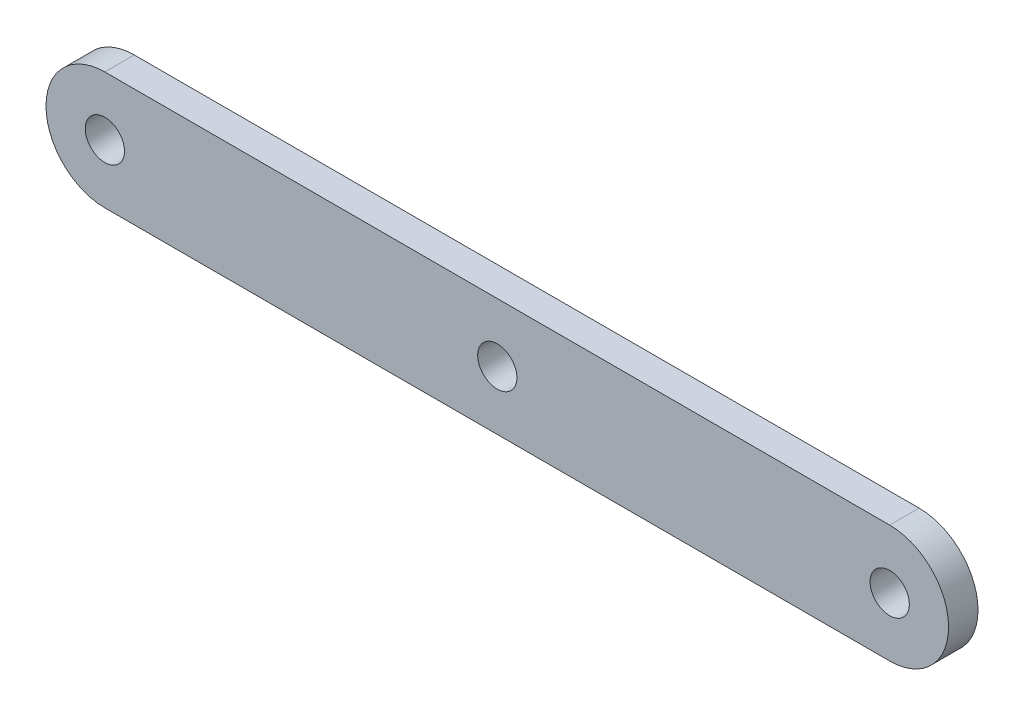
ISO-10303-21;
HEADER;
FILE_DESCRIPTION(('STEP AP214'),'2;1');
FILE_NAME('part.step','',(''),(''),'','','');
FILE_SCHEMA(('AUTOMOTIVE_DESIGN { 1 0 10303 214 1 1 1 1 }'));
ENDSEC;
DATA;
#1=APPLICATION_CONTEXT('core data for automotive mechanical design processes');
#2=APPLICATION_PROTOCOL_DEFINITION('international standard','automotive_design',2000,#1);
#3=PRODUCT_CONTEXT('',#1,'mechanical');
#4=PRODUCT('Part','Part','',(#3));
#5=PRODUCT_RELATED_PRODUCT_CATEGORY('part','',(#4));
#6=PRODUCT_DEFINITION_FORMATION('','',#4);
#7=PRODUCT_DEFINITION_CONTEXT('part definition',#1,'design');
#8=PRODUCT_DEFINITION('design','',#6,#7);
#9=PRODUCT_DEFINITION_SHAPE('','',#8);
#10=(LENGTH_UNIT() NAMED_UNIT(*) SI_UNIT(.MILLI.,.METRE.));
#11=(NAMED_UNIT(*) PLANE_ANGLE_UNIT() SI_UNIT($,.RADIAN.));
#12=(NAMED_UNIT(*) SI_UNIT($,.STERADIAN.) SOLID_ANGLE_UNIT());
#13=UNCERTAINTY_MEASURE_WITH_UNIT(LENGTH_MEASURE(1.E-05),#10,'distance_accuracy_value','');
#14=(GEOMETRIC_REPRESENTATION_CONTEXT(3) GLOBAL_UNCERTAINTY_ASSIGNED_CONTEXT((#13)) GLOBAL_UNIT_ASSIGNED_CONTEXT((#10,
#11,#12)) REPRESENTATION_CONTEXT('',''));
#15=CARTESIAN_POINT('',(0.,0.,0.));
#16=DIRECTION('',(0.,0.,1.));
#17=DIRECTION('',(1.,0.,0.));
#18=AXIS2_PLACEMENT_3D('',#15,#16,#17);
#19=CARTESIAN_POINT('',(-35.3127241673783,0.,3.));
#20=DIRECTION('',(0.,0.,1.));
#21=DIRECTION('',(1.,0.,0.));
#22=AXIS2_PLACEMENT_3D('',#19,#20,#21);
#23=PLANE('',#22);
#24=CARTESIAN_POINT('',(44.6872758326217,0.,3.));
#25=DIRECTION('',(0.,0.,1.));
#26=DIRECTION('',(1.,0.,0.));
#27=AXIS2_PLACEMENT_3D('',#24,#25,#26);
#28=CIRCLE('',#27,2.);
#29=CARTESIAN_POINT('',(46.6872758326217,0.,3.));
#30=VERTEX_POINT('',#29);
#31=EDGE_CURVE('E115',#30,#30,#28,.T.);
#32=ORIENTED_EDGE('',*,*,#31,.F.);
#33=EDGE_LOOP('',(#32));
#34=FACE_BOUND('',#33,.T.);
#35=CARTESIAN_POINT('',(-35.3127241673783,0.,3.));
#36=DIRECTION('',(0.,0.,1.));
#37=DIRECTION('',(1.,0.,0.));
#38=AXIS2_PLACEMENT_3D('',#35,#36,#37);
#39=CIRCLE('',#38,6.);
#40=CARTESIAN_POINT('',(-35.3127241673783,6.,3.));
#41=VERTEX_POINT('',#40);
#42=CARTESIAN_POINT('',(-35.3127241673783,-6.,3.));
#43=VERTEX_POINT('',#42);
#44=EDGE_CURVE('E85',#41,#43,#39,.T.);
#45=ORIENTED_EDGE('',*,*,#44,.T.);
#46=DIRECTION('',(1.,0.,0.));
#47=VECTOR('',#46,1.);
#48=CARTESIAN_POINT('',(-35.3127241673783,-6.,3.));
#49=LINE('',#48,#47);
#50=CARTESIAN_POINT('',(44.6872758326217,-6.,3.));
#51=VERTEX_POINT('',#50);
#52=EDGE_CURVE('E80',#43,#51,#49,.T.);
#53=ORIENTED_EDGE('',*,*,#52,.T.);
#54=CARTESIAN_POINT('',(44.6872758326217,0.,3.));
#55=DIRECTION('',(0.,0.,1.));
#56=DIRECTION('',(1.,0.,0.));
#57=AXIS2_PLACEMENT_3D('',#54,#55,#56);
#58=CIRCLE('',#57,6.);
#59=CARTESIAN_POINT('',(44.6872758326217,6.,3.));
#60=VERTEX_POINT('',#59);
#61=EDGE_CURVE('E83',#51,#60,#58,.T.);
#62=ORIENTED_EDGE('',*,*,#61,.T.);
#63=DIRECTION('',(-1.,0.,0.));
#64=VECTOR('',#63,1.);
#65=CARTESIAN_POINT('',(-35.3127241673783,6.,3.));
#66=LINE('',#65,#64);
#67=EDGE_CURVE('E50',#60,#41,#66,.T.);
#68=ORIENTED_EDGE('',*,*,#67,.T.);
#69=EDGE_LOOP('',(#45,#53,#62,#68));
#70=FACE_BOUND('',#69,.T.);
#71=CARTESIAN_POINT('',(-35.3127241673783,0.,3.));
#72=DIRECTION('',(0.,0.,1.));
#73=DIRECTION('',(1.,0.,0.));
#74=AXIS2_PLACEMENT_3D('',#71,#72,#73);
#75=CIRCLE('',#74,2.);
#76=CARTESIAN_POINT('',(-33.3127241673783,0.,3.));
#77=VERTEX_POINT('',#76);
#78=EDGE_CURVE('E100',#77,#77,#75,.T.);
#79=ORIENTED_EDGE('',*,*,#78,.F.);
#80=EDGE_LOOP('',(#79));
#81=FACE_BOUND('',#80,.T.);
#82=CARTESIAN_POINT('',(4.68727583262171,0.,3.));
#83=DIRECTION('',(0.,0.,1.));
#84=DIRECTION('',(1.,0.,0.));
#85=AXIS2_PLACEMENT_3D('',#82,#83,#84);
#86=CIRCLE('',#85,2.);
#87=CARTESIAN_POINT('',(6.68727583262171,0.,3.));
#88=VERTEX_POINT('',#87);
#89=EDGE_CURVE('E121',#88,#88,#86,.T.);
#90=ORIENTED_EDGE('',*,*,#89,.F.);
#91=EDGE_LOOP('',(#90));
#92=FACE_BOUND('',#91,.T.);
#93=ADVANCED_FACE('F33',(#34,#70,#81,#92),#23,.T.);
#94=CARTESIAN_POINT('',(-35.3127241673783,0.,0.));
#95=DIRECTION('',(0.,0.,1.));
#96=DIRECTION('',(1.,0.,0.));
#97=AXIS2_PLACEMENT_3D('',#94,#95,#96);
#98=PLANE('',#97);
#99=CARTESIAN_POINT('',(44.6872758326217,0.,0.));
#100=DIRECTION('',(0.,0.,1.));
#101=DIRECTION('',(1.,0.,0.));
#102=AXIS2_PLACEMENT_3D('',#99,#100,#101);
#103=CIRCLE('',#102,2.);
#104=CARTESIAN_POINT('',(46.6872758326217,0.,0.));
#105=VERTEX_POINT('',#104);
#106=EDGE_CURVE('E118',#105,#105,#103,.T.);
#107=ORIENTED_EDGE('',*,*,#106,.T.);
#108=EDGE_LOOP('',(#107));
#109=FACE_BOUND('',#108,.T.);
#110=CARTESIAN_POINT('',(-35.3127241673783,0.,0.));
#111=DIRECTION('',(0.,0.,1.));
#112=DIRECTION('',(1.,0.,0.));
#113=AXIS2_PLACEMENT_3D('',#110,#111,#112);
#114=CIRCLE('',#113,6.);
#115=CARTESIAN_POINT('',(-35.3127241673783,6.,0.));
#116=VERTEX_POINT('',#115);
#117=CARTESIAN_POINT('',(-35.3127241673783,-6.,0.));
#118=VERTEX_POINT('',#117);
#119=EDGE_CURVE('E97',#116,#118,#114,.T.);
#120=ORIENTED_EDGE('',*,*,#119,.F.);
#121=DIRECTION('',(-1.,0.,0.));
#122=VECTOR('',#121,1.);
#123=CARTESIAN_POINT('',(-35.3127241673783,6.,0.));
#124=LINE('',#123,#122);
#125=CARTESIAN_POINT('',(44.6872758326217,6.,0.));
#126=VERTEX_POINT('',#125);
#127=EDGE_CURVE('E73',#126,#116,#124,.T.);
#128=ORIENTED_EDGE('',*,*,#127,.F.);
#129=CARTESIAN_POINT('',(44.6872758326217,0.,0.));
#130=DIRECTION('',(0.,0.,1.));
#131=DIRECTION('',(1.,0.,0.));
#132=AXIS2_PLACEMENT_3D('',#129,#130,#131);
#133=CIRCLE('',#132,6.);
#134=CARTESIAN_POINT('',(44.6872758326217,-6.,0.));
#135=VERTEX_POINT('',#134);
#136=EDGE_CURVE('E67',#135,#126,#133,.T.);
#137=ORIENTED_EDGE('',*,*,#136,.F.);
#138=DIRECTION('',(1.,0.,0.));
#139=VECTOR('',#138,1.);
#140=CARTESIAN_POINT('',(-35.3127241673783,-6.,0.));
#141=LINE('',#140,#139);
#142=EDGE_CURVE('E89',#118,#135,#141,.T.);
#143=ORIENTED_EDGE('',*,*,#142,.F.);
#144=EDGE_LOOP('',(#120,#128,#137,#143));
#145=FACE_BOUND('',#144,.T.);
#146=CARTESIAN_POINT('',(-35.3127241673783,0.,0.));
#147=DIRECTION('',(0.,0.,1.));
#148=DIRECTION('',(1.,0.,0.));
#149=AXIS2_PLACEMENT_3D('',#146,#147,#148);
#150=CIRCLE('',#149,2.);
#151=CARTESIAN_POINT('',(-33.3127241673783,0.,0.));
#152=VERTEX_POINT('',#151);
#153=EDGE_CURVE('E112',#152,#152,#150,.T.);
#154=ORIENTED_EDGE('',*,*,#153,.T.);
#155=EDGE_LOOP('',(#154));
#156=FACE_BOUND('',#155,.T.);
#157=CARTESIAN_POINT('',(4.68727583262171,0.,0.));
#158=DIRECTION('',(0.,0.,1.));
#159=DIRECTION('',(1.,0.,0.));
#160=AXIS2_PLACEMENT_3D('',#157,#158,#159);
#161=CIRCLE('',#160,2.);
#162=CARTESIAN_POINT('',(6.68727583262171,0.,0.));
#163=VERTEX_POINT('',#162);
#164=EDGE_CURVE('E124',#163,#163,#161,.T.);
#165=ORIENTED_EDGE('',*,*,#164,.T.);
#166=EDGE_LOOP('',(#165));
#167=FACE_BOUND('',#166,.T.);
#168=ADVANCED_FACE('F108',(#109,#145,#156,#167),#98,.F.);
#169=CARTESIAN_POINT('',(-35.3127241673783,0.,3.));
#170=DIRECTION('',(0.,0.,-1.));
#171=DIRECTION('',(-1.,0.,0.));
#172=AXIS2_PLACEMENT_3D('',#169,#170,#171);
#173=CYLINDRICAL_SURFACE('',#172,6.);
#174=ORIENTED_EDGE('',*,*,#119,.T.);
#175=DIRECTION('',(0.,0.,-1.));
#176=VECTOR('',#175,1.);
#177=CARTESIAN_POINT('',(-35.3127241673783,-6.,3.));
#178=LINE('',#177,#176);
#179=EDGE_CURVE('E11',#43,#118,#178,.T.);
#180=ORIENTED_EDGE('',*,*,#179,.F.);
#181=ORIENTED_EDGE('',*,*,#44,.F.);
#182=DIRECTION('',(0.,0.,-1.));
#183=VECTOR('',#182,1.);
#184=CARTESIAN_POINT('',(-35.3127241673783,6.,3.));
#185=LINE('',#184,#183);
#186=EDGE_CURVE('E93',#41,#116,#185,.T.);
#187=ORIENTED_EDGE('',*,*,#186,.T.);
#188=EDGE_LOOP('',(#174,#180,#181,#187));
#189=FACE_BOUND('',#188,.T.);
#190=ADVANCED_FACE('F35',(#189),#173,.T.);
#191=CARTESIAN_POINT('',(-35.3127241673783,-6.,3.));
#192=DIRECTION('',(0.,1.,0.));
#193=DIRECTION('',(0.,0.,1.));
#194=AXIS2_PLACEMENT_3D('',#191,#192,#193);
#195=PLANE('',#194);
#196=ORIENTED_EDGE('',*,*,#142,.T.);
#197=DIRECTION('',(0.,0.,-1.));
#198=VECTOR('',#197,1.);
#199=CARTESIAN_POINT('',(44.6872758326217,-6.,3.));
#200=LINE('',#199,#198);
#201=EDGE_CURVE('E42',#51,#135,#200,.T.);
#202=ORIENTED_EDGE('',*,*,#201,.F.);
#203=ORIENTED_EDGE('',*,*,#52,.F.);
#204=ORIENTED_EDGE('',*,*,#179,.T.);
#205=EDGE_LOOP('',(#196,#202,#203,#204));
#206=FACE_BOUND('',#205,.T.);
#207=ADVANCED_FACE('F88',(#206),#195,.F.);
#208=CARTESIAN_POINT('',(44.6872758326217,0.,3.));
#209=DIRECTION('',(0.,0.,-1.));
#210=DIRECTION('',(-1.,0.,0.));
#211=AXIS2_PLACEMENT_3D('',#208,#209,#210);
#212=CYLINDRICAL_SURFACE('',#211,6.);
#213=ORIENTED_EDGE('',*,*,#136,.T.);
#214=DIRECTION('',(0.,0.,-1.));
#215=VECTOR('',#214,1.);
#216=CARTESIAN_POINT('',(44.6872758326217,6.,3.));
#217=LINE('',#216,#215);
#218=EDGE_CURVE('E90',#60,#126,#217,.T.);
#219=ORIENTED_EDGE('',*,*,#218,.F.);
#220=ORIENTED_EDGE('',*,*,#61,.F.);
#221=ORIENTED_EDGE('',*,*,#201,.T.);
#222=EDGE_LOOP('',(#213,#219,#220,#221));
#223=FACE_BOUND('',#222,.T.);
#224=ADVANCED_FACE('F91',(#223),#212,.T.);
#225=CARTESIAN_POINT('',(-35.3127241673783,6.,3.));
#226=DIRECTION('',(0.,-1.,0.));
#227=DIRECTION('',(0.,0.,-1.));
#228=AXIS2_PLACEMENT_3D('',#225,#226,#227);
#229=PLANE('',#228);
#230=ORIENTED_EDGE('',*,*,#127,.T.);
#231=ORIENTED_EDGE('',*,*,#186,.F.);
#232=ORIENTED_EDGE('',*,*,#67,.F.);
#233=ORIENTED_EDGE('',*,*,#218,.T.);
#234=EDGE_LOOP('',(#230,#231,#232,#233));
#235=FACE_BOUND('',#234,.T.);
#236=ADVANCED_FACE('F105',(#235),#229,.F.);
#237=CARTESIAN_POINT('',(-35.3127241673783,0.,3.));
#238=DIRECTION('',(0.,0.,-1.));
#239=DIRECTION('',(-1.,0.,0.));
#240=AXIS2_PLACEMENT_3D('',#237,#238,#239);
#241=CYLINDRICAL_SURFACE('',#240,2.);
#242=ORIENTED_EDGE('',*,*,#78,.T.);
#243=EDGE_LOOP('',(#242));
#244=FACE_BOUND('',#243,.T.);
#245=ORIENTED_EDGE('',*,*,#153,.F.);
#246=EDGE_LOOP('',(#245));
#247=FACE_BOUND('',#246,.T.);
#248=ADVANCED_FACE('F143',(#244,#247),#241,.F.);
#249=CARTESIAN_POINT('',(44.6872758326217,0.,3.));
#250=DIRECTION('',(0.,0.,-1.));
#251=DIRECTION('',(-1.,0.,0.));
#252=AXIS2_PLACEMENT_3D('',#249,#250,#251);
#253=CYLINDRICAL_SURFACE('',#252,2.);
#254=ORIENTED_EDGE('',*,*,#31,.T.);
#255=EDGE_LOOP('',(#254));
#256=FACE_BOUND('',#255,.T.);
#257=ORIENTED_EDGE('',*,*,#106,.F.);
#258=EDGE_LOOP('',(#257));
#259=FACE_BOUND('',#258,.T.);
#260=ADVANCED_FACE('F189',(#256,#259),#253,.F.);
#261=CARTESIAN_POINT('',(4.68727583262171,0.,3.));
#262=DIRECTION('',(0.,0.,-1.));
#263=DIRECTION('',(-1.,0.,0.));
#264=AXIS2_PLACEMENT_3D('',#261,#262,#263);
#265=CYLINDRICAL_SURFACE('',#264,2.);
#266=ORIENTED_EDGE('',*,*,#89,.T.);
#267=EDGE_LOOP('',(#266));
#268=FACE_BOUND('',#267,.T.);
#269=ORIENTED_EDGE('',*,*,#164,.F.);
#270=EDGE_LOOP('',(#269));
#271=FACE_BOUND('',#270,.T.);
#272=ADVANCED_FACE('F130',(#268,#271),#265,.F.);
#273=CLOSED_SHELL('',(#93,#168,#190,#207,#224,#236,#248,#260,#272));
#274=MANIFOLD_SOLID_BREP('B2',#273);
#275=ADVANCED_BREP_SHAPE_REPRESENTATION('',(#18,#274),#14);
#276=SHAPE_DEFINITION_REPRESENTATION(#9,#275);
ENDSEC;
END-ISO-10303-21;
